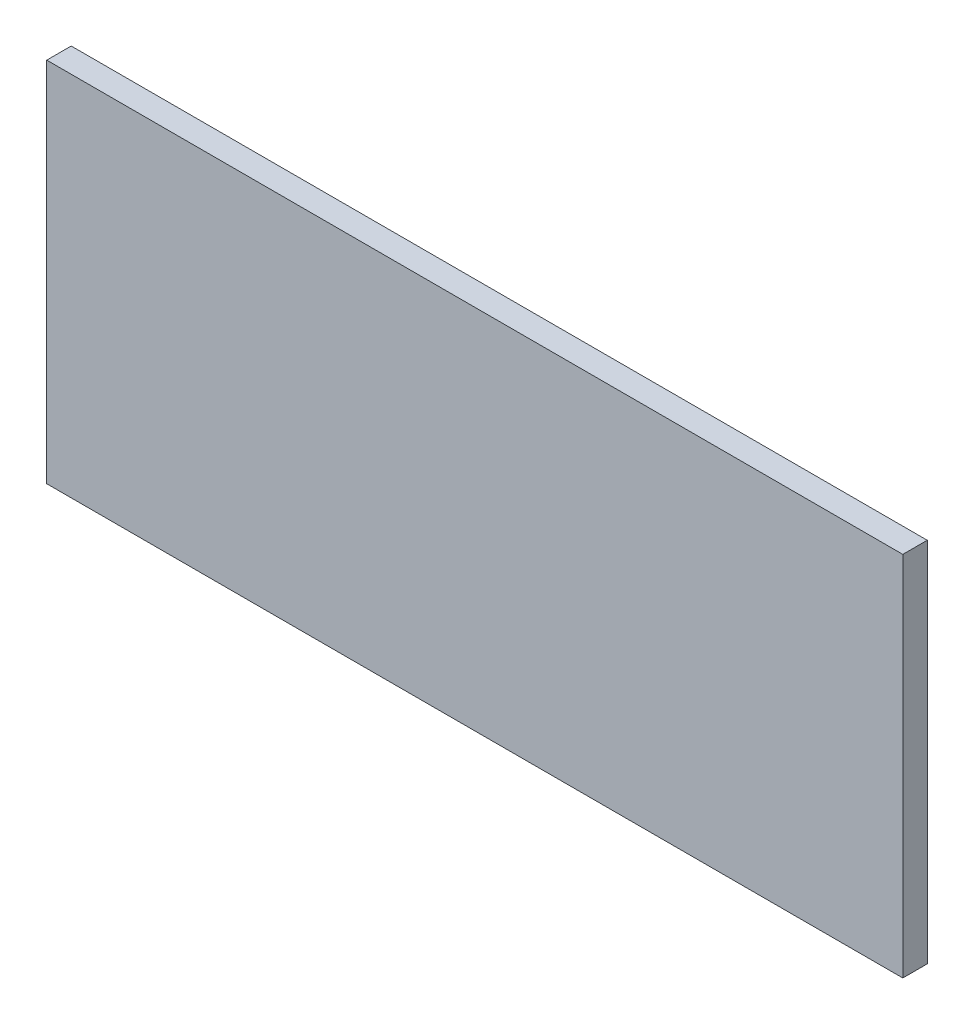
ISO-10303-21;
HEADER;
FILE_DESCRIPTION(('STEP AP214'),'2;1');
FILE_NAME('part.step','',(''),(''),'','','');
FILE_SCHEMA(('AUTOMOTIVE_DESIGN { 1 0 10303 214 1 1 1 1 }'));
ENDSEC;
DATA;
#1=APPLICATION_CONTEXT('core data for automotive mechanical design processes');
#2=APPLICATION_PROTOCOL_DEFINITION('international standard','automotive_design',2000,#1);
#3=PRODUCT_CONTEXT('',#1,'mechanical');
#4=PRODUCT('Part','Part','',(#3));
#5=PRODUCT_RELATED_PRODUCT_CATEGORY('part','',(#4));
#6=PRODUCT_DEFINITION_FORMATION('','',#4);
#7=PRODUCT_DEFINITION_CONTEXT('part definition',#1,'design');
#8=PRODUCT_DEFINITION('design','',#6,#7);
#9=PRODUCT_DEFINITION_SHAPE('','',#8);
#10=(LENGTH_UNIT() NAMED_UNIT(*) SI_UNIT(.MILLI.,.METRE.));
#11=(NAMED_UNIT(*) PLANE_ANGLE_UNIT() SI_UNIT($,.RADIAN.));
#12=(NAMED_UNIT(*) SI_UNIT($,.STERADIAN.) SOLID_ANGLE_UNIT());
#13=UNCERTAINTY_MEASURE_WITH_UNIT(LENGTH_MEASURE(1.E-05),#10,'distance_accuracy_value','');
#14=(GEOMETRIC_REPRESENTATION_CONTEXT(3) GLOBAL_UNCERTAINTY_ASSIGNED_CONTEXT((#13)) GLOBAL_UNIT_ASSIGNED_CONTEXT((#10,
#11,#12)) REPRESENTATION_CONTEXT('',''));
#15=CARTESIAN_POINT('',(0.,0.,0.));
#16=DIRECTION('',(0.,0.,1.));
#17=DIRECTION('',(1.,0.,0.));
#18=AXIS2_PLACEMENT_3D('',#15,#16,#17);
#19=CARTESIAN_POINT('',(0.,0.,4.));
#20=DIRECTION('',(-1.,0.,0.));
#21=DIRECTION('',(0.,0.,1.));
#22=AXIS2_PLACEMENT_3D('',#19,#20,#21);
#23=PLANE('',#22);
#24=DIRECTION('',(0.,1.,0.));
#25=VECTOR('',#24,1.);
#26=CARTESIAN_POINT('',(0.,0.,0.));
#27=LINE('',#26,#25);
#28=CARTESIAN_POINT('',(0.,0.,0.));
#29=VERTEX_POINT('',#28);
#30=CARTESIAN_POINT('',(0.,60.0000000000001,0.));
#31=VERTEX_POINT('',#30);
#32=EDGE_CURVE('E107',#29,#31,#27,.T.);
#33=ORIENTED_EDGE('',*,*,#32,.T.);
#34=DIRECTION('',(0.,0.,-1.));
#35=VECTOR('',#34,1.);
#36=CARTESIAN_POINT('',(0.,60.0000000000001,4.));
#37=LINE('',#36,#35);
#38=CARTESIAN_POINT('',(0.,60.0000000000001,4.));
#39=VERTEX_POINT('',#38);
#40=EDGE_CURVE('E11',#39,#31,#37,.T.);
#41=ORIENTED_EDGE('',*,*,#40,.F.);
#42=DIRECTION('',(0.,1.,0.));
#43=VECTOR('',#42,1.);
#44=CARTESIAN_POINT('',(0.,0.,4.));
#45=LINE('',#44,#43);
#46=CARTESIAN_POINT('',(0.,0.,4.));
#47=VERTEX_POINT('',#46);
#48=EDGE_CURVE('E91',#47,#39,#45,.T.);
#49=ORIENTED_EDGE('',*,*,#48,.F.);
#50=DIRECTION('',(0.,0.,-1.));
#51=VECTOR('',#50,1.);
#52=CARTESIAN_POINT('',(0.,0.,4.));
#53=LINE('',#52,#51);
#54=EDGE_CURVE('E103',#47,#29,#53,.T.);
#55=ORIENTED_EDGE('',*,*,#54,.T.);
#56=EDGE_LOOP('',(#33,#41,#49,#55));
#57=FACE_BOUND('',#56,.T.);
#58=ADVANCED_FACE('F39',(#57),#23,.F.);
#59=CARTESIAN_POINT('',(0.,60.0000000000001,4.));
#60=DIRECTION('',(0.,-1.,0.));
#61=DIRECTION('',(1.,0.,0.));
#62=AXIS2_PLACEMENT_3D('',#59,#60,#61);
#63=PLANE('',#62);
#64=DIRECTION('',(-1.,0.,0.));
#65=VECTOR('',#64,1.);
#66=CARTESIAN_POINT('',(0.,60.0000000000001,0.));
#67=LINE('',#66,#65);
#68=CARTESIAN_POINT('',(-140.,59.9999999999996,0.));
#69=VERTEX_POINT('',#68);
#70=EDGE_CURVE('E96',#31,#69,#67,.T.);
#71=ORIENTED_EDGE('',*,*,#70,.T.);
#72=DIRECTION('',(0.,0.,-1.));
#73=VECTOR('',#72,1.);
#74=CARTESIAN_POINT('',(-140.,59.9999999999996,4.));
#75=LINE('',#74,#73);
#76=CARTESIAN_POINT('',(-140.,59.9999999999996,4.));
#77=VERTEX_POINT('',#76);
#78=EDGE_CURVE('E48',#77,#69,#75,.T.);
#79=ORIENTED_EDGE('',*,*,#78,.F.);
#80=DIRECTION('',(-1.,0.,0.));
#81=VECTOR('',#80,1.);
#82=CARTESIAN_POINT('',(0.,60.0000000000001,4.));
#83=LINE('',#82,#81);
#84=EDGE_CURVE('E86',#39,#77,#83,.T.);
#85=ORIENTED_EDGE('',*,*,#84,.F.);
#86=ORIENTED_EDGE('',*,*,#40,.T.);
#87=EDGE_LOOP('',(#71,#79,#85,#86));
#88=FACE_BOUND('',#87,.T.);
#89=ADVANCED_FACE('F95',(#88),#63,.F.);
#90=CARTESIAN_POINT('',(-140.,0.,4.));
#91=DIRECTION('',(1.,0.,0.));
#92=DIRECTION('',(0.,0.,-1.));
#93=AXIS2_PLACEMENT_3D('',#90,#91,#92);
#94=PLANE('',#93);
#95=DIRECTION('',(0.,-1.,0.));
#96=VECTOR('',#95,1.);
#97=CARTESIAN_POINT('',(-140.,0.,0.));
#98=LINE('',#97,#96);
#99=CARTESIAN_POINT('',(-140.,0.,0.));
#100=VERTEX_POINT('',#99);
#101=EDGE_CURVE('E73',#69,#100,#98,.T.);
#102=ORIENTED_EDGE('',*,*,#101,.T.);
#103=DIRECTION('',(0.,0.,-1.));
#104=VECTOR('',#103,1.);
#105=CARTESIAN_POINT('',(-140.,0.,4.));
#106=LINE('',#105,#104);
#107=CARTESIAN_POINT('',(-140.,0.,4.));
#108=VERTEX_POINT('',#107);
#109=EDGE_CURVE('E98',#108,#100,#106,.T.);
#110=ORIENTED_EDGE('',*,*,#109,.F.);
#111=DIRECTION('',(0.,-1.,0.));
#112=VECTOR('',#111,1.);
#113=CARTESIAN_POINT('',(-140.,0.,4.));
#114=LINE('',#113,#112);
#115=EDGE_CURVE('E89',#77,#108,#114,.T.);
#116=ORIENTED_EDGE('',*,*,#115,.F.);
#117=ORIENTED_EDGE('',*,*,#78,.T.);
#118=EDGE_LOOP('',(#102,#110,#116,#117));
#119=FACE_BOUND('',#118,.T.);
#120=ADVANCED_FACE('F99',(#119),#94,.F.);
#121=CARTESIAN_POINT('',(0.,0.,4.));
#122=DIRECTION('',(0.,1.,0.));
#123=DIRECTION('',(-1.,0.,0.));
#124=AXIS2_PLACEMENT_3D('',#121,#122,#123);
#125=PLANE('',#124);
#126=DIRECTION('',(1.,0.,0.));
#127=VECTOR('',#126,1.);
#128=CARTESIAN_POINT('',(0.,0.,0.));
#129=LINE('',#128,#127);
#130=EDGE_CURVE('E79',#100,#29,#129,.T.);
#131=ORIENTED_EDGE('',*,*,#130,.T.);
#132=ORIENTED_EDGE('',*,*,#54,.F.);
#133=DIRECTION('',(1.,0.,0.));
#134=VECTOR('',#133,1.);
#135=CARTESIAN_POINT('',(0.,0.,4.));
#136=LINE('',#135,#134);
#137=EDGE_CURVE('E56',#108,#47,#136,.T.);
#138=ORIENTED_EDGE('',*,*,#137,.F.);
#139=ORIENTED_EDGE('',*,*,#109,.T.);
#140=EDGE_LOOP('',(#131,#132,#138,#139));
#141=FACE_BOUND('',#140,.T.);
#142=ADVANCED_FACE('F120',(#141),#125,.F.);
#143=CARTESIAN_POINT('',(0.,0.,4.));
#144=DIRECTION('',(0.,0.,1.));
#145=DIRECTION('',(1.,0.,0.));
#146=AXIS2_PLACEMENT_3D('',#143,#144,#145);
#147=PLANE('',#146);
#148=ORIENTED_EDGE('',*,*,#48,.T.);
#149=ORIENTED_EDGE('',*,*,#84,.T.);
#150=ORIENTED_EDGE('',*,*,#115,.T.);
#151=ORIENTED_EDGE('',*,*,#137,.T.);
#152=EDGE_LOOP('',(#148,#149,#150,#151));
#153=FACE_BOUND('',#152,.T.);
#154=ADVANCED_FACE('F87',(#153),#147,.T.);
#155=CARTESIAN_POINT('',(0.,0.,0.));
#156=DIRECTION('',(0.,0.,1.));
#157=DIRECTION('',(1.,0.,0.));
#158=AXIS2_PLACEMENT_3D('',#155,#156,#157);
#159=PLANE('',#158);
#160=ORIENTED_EDGE('',*,*,#32,.F.);
#161=ORIENTED_EDGE('',*,*,#130,.F.);
#162=ORIENTED_EDGE('',*,*,#101,.F.);
#163=ORIENTED_EDGE('',*,*,#70,.F.);
#164=EDGE_LOOP('',(#160,#161,#162,#163));
#165=FACE_BOUND('',#164,.T.);
#166=ADVANCED_FACE('F123',(#165),#159,.F.);
#167=CLOSED_SHELL('',(#58,#89,#120,#142,#154,#166));
#168=MANIFOLD_SOLID_BREP('B2',#167);
#169=ADVANCED_BREP_SHAPE_REPRESENTATION('',(#18,#168),#14);
#170=SHAPE_DEFINITION_REPRESENTATION(#9,#169);
ENDSEC;
END-ISO-10303-21;
